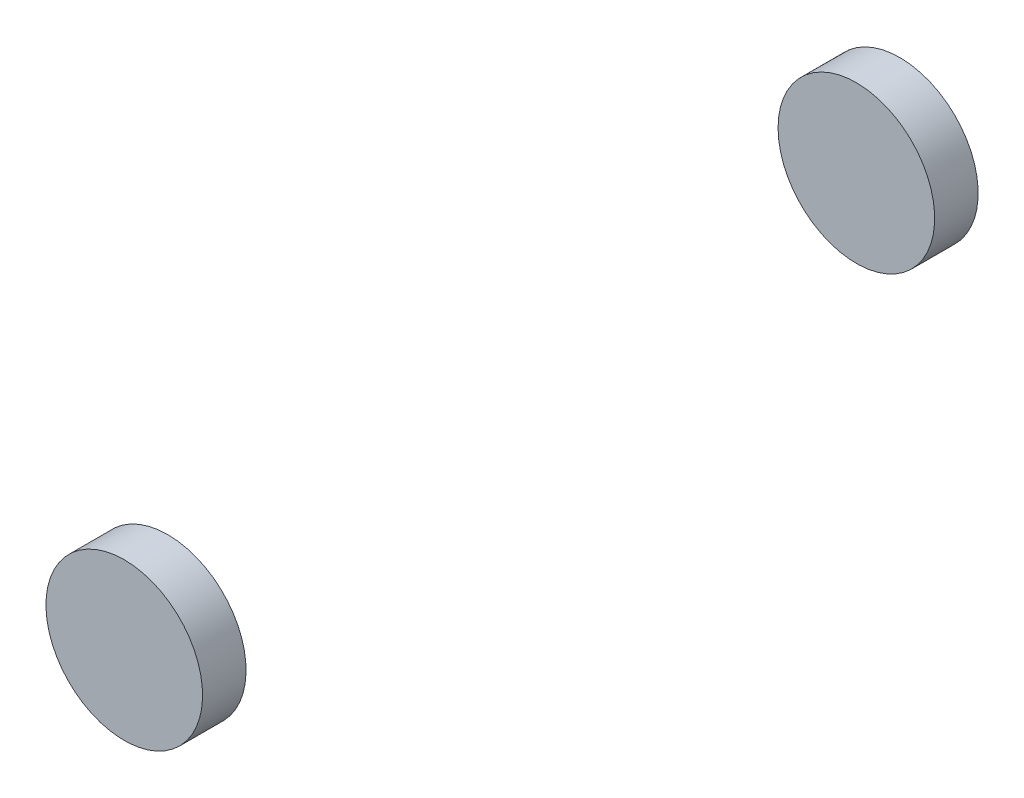
ISO-10303-21;
HEADER;
FILE_DESCRIPTION(('STEP AP214'),'2;1');
FILE_NAME('part.step','',(''),(''),'','','');
FILE_SCHEMA(('AUTOMOTIVE_DESIGN { 1 0 10303 214 1 1 1 1 }'));
ENDSEC;
DATA;
#1=APPLICATION_CONTEXT('core data for automotive mechanical design processes');
#2=APPLICATION_PROTOCOL_DEFINITION('international standard','automotive_design',2000,#1);
#3=PRODUCT_CONTEXT('',#1,'mechanical');
#4=PRODUCT('Part','Part','',(#3));
#5=PRODUCT_RELATED_PRODUCT_CATEGORY('part','',(#4));
#6=PRODUCT_DEFINITION_FORMATION('','',#4);
#7=PRODUCT_DEFINITION_CONTEXT('part definition',#1,'design');
#8=PRODUCT_DEFINITION('design','',#6,#7);
#9=PRODUCT_DEFINITION_SHAPE('','',#8);
#10=(LENGTH_UNIT() NAMED_UNIT(*) SI_UNIT(.MILLI.,.METRE.));
#11=(NAMED_UNIT(*) PLANE_ANGLE_UNIT() SI_UNIT($,.RADIAN.));
#12=(NAMED_UNIT(*) SI_UNIT($,.STERADIAN.) SOLID_ANGLE_UNIT());
#13=UNCERTAINTY_MEASURE_WITH_UNIT(LENGTH_MEASURE(1.E-05),#10,'distance_accuracy_value','');
#14=(GEOMETRIC_REPRESENTATION_CONTEXT(3) GLOBAL_UNCERTAINTY_ASSIGNED_CONTEXT((#13)) GLOBAL_UNIT_ASSIGNED_CONTEXT((#10,
#11,#12)) REPRESENTATION_CONTEXT('',''));
#15=CARTESIAN_POINT('',(0.,0.,0.));
#16=DIRECTION('',(0.,0.,1.));
#17=DIRECTION('',(1.,0.,0.));
#18=AXIS2_PLACEMENT_3D('',#15,#16,#17);
#19=CARTESIAN_POINT('',(12.0649929811173,23.0309677547519,-0.253998963258981));
#20=DIRECTION('',(0.,-8.74227339409092E-08,1.));
#21=DIRECTION('',(1.,-8.74227765734792E-08,0.));
#22=AXIS2_PLACEMENT_3D('',#19,#20,#21);
#23=PLANE('',#22);
#24=CARTESIAN_POINT('',(12.5221929811173,23.0309677147822,-0.253998963258985));
#25=DIRECTION('',(0.,8.74227339409092E-08,-1.));
#26=DIRECTION('',(-1.,8.74227765734792E-08,0.));
#27=AXIS2_PLACEMENT_3D('',#24,#25,#26);
#28=CIRCLE('',#27,0.4572);
#29=CARTESIAN_POINT('',(12.0649929811173,23.0309677547519,-0.253998963258982));
#30=VERTEX_POINT('',#29);
#31=EDGE_CURVE('P0_E10',#30,#30,#28,.T.);
#32=ORIENTED_EDGE('',*,*,#31,.T.);
#33=EDGE_LOOP('',(#32));
#34=FACE_BOUND('',#33,.T.);
#35=ADVANCED_FACE('P0_F15',(#34),#23,.F.);
#36=CARTESIAN_POINT('',(12.0649929811173,23.0309677325465,1.0367410172539E-06));
#37=DIRECTION('',(0.,-8.74227339409092E-08,1.));
#38=DIRECTION('',(1.,-8.74227765734792E-08,0.));
#39=AXIS2_PLACEMENT_3D('',#36,#37,#38);
#40=PLANE('',#39);
#41=CARTESIAN_POINT('',(12.5221929811173,23.0309676925768,1.03674101378445E-06));
#42=DIRECTION('',(0.,8.74227339409092E-08,-1.));
#43=DIRECTION('',(-1.,8.74227765734792E-08,0.));
#44=AXIS2_PLACEMENT_3D('',#41,#42,#43);
#45=CIRCLE('',#44,0.4572);
#46=CARTESIAN_POINT('',(12.0649929811173,23.0309677325465,1.03674101727871E-06));
#47=VERTEX_POINT('',#46);
#48=EDGE_CURVE('P0_E22',#47,#47,#45,.T.);
#49=ORIENTED_EDGE('',*,*,#48,.F.);
#50=EDGE_LOOP('',(#49));
#51=FACE_BOUND('',#50,.T.);
#52=ADVANCED_FACE('P0_F35',(#51),#40,.T.);
#53=CARTESIAN_POINT('',(12.5221929811173,23.0309676925768,1.03674101378445E-06));
#54=DIRECTION('',(0.,-8.74227339409092E-08,1.));
#55=DIRECTION('',(-1.,8.74227765734792E-08,0.));
#56=AXIS2_PLACEMENT_3D('',#53,#54,#55);
#57=CYLINDRICAL_SURFACE('',#56,0.4572);
#58=ORIENTED_EDGE('',*,*,#31,.F.);
#59=EDGE_LOOP('',(#58));
#60=FACE_BOUND('',#59,.T.);
#61=ORIENTED_EDGE('',*,*,#48,.T.);
#62=EDGE_LOOP('',(#61));
#63=FACE_BOUND('',#62,.T.);
#64=ADVANCED_FACE('P0_F33',(#60,#63),#57,.T.);
#65=CLOSED_SHELL('',(#35,#52,#64));
#66=MANIFOLD_SOLID_BREP('P0_B1',#65);
#67=CARTESIAN_POINT('',(8.24719909008972,18.9381646630226,-0.253998923289316));
#68=DIRECTION('',(0.,-8.74227339409095E-08,1.));
#69=DIRECTION('',(-1.19248806384999E-08,-1.,-8.74227339409095E-08));
#70=AXIS2_PLACEMENT_3D('',#67,#68,#69);
#71=PLANE('',#70);
#72=CARTESIAN_POINT('',(8.24719908463767,18.4809646630226,-0.253998963258991));
#73=DIRECTION('',(0.,8.74227339409095E-08,-1.));
#74=DIRECTION('',(1.19248806384999E-08,1.,8.74227339409095E-08));
#75=AXIS2_PLACEMENT_3D('',#72,#73,#74);
#76=CIRCLE('',#75,0.4572);
#77=CARTESIAN_POINT('',(8.24719909008973,18.9381646630226,-0.253998923289317));
#78=VERTEX_POINT('',#77);
#79=EDGE_CURVE('P1_E10',#78,#78,#76,.T.);
#80=ORIENTED_EDGE('',*,*,#79,.T.);
#81=EDGE_LOOP('',(#80));
#82=FACE_BOUND('',#81,.T.);
#83=ADVANCED_FACE('P1_F15',(#82),#71,.F.);
#84=CARTESIAN_POINT('',(8.24719909008972,18.9381646408171,1.07671068285201E-06));
#85=DIRECTION('',(0.,-8.74227339409095E-08,1.));
#86=DIRECTION('',(-1.19248806384999E-08,-1.,-8.74227339409095E-08));
#87=AXIS2_PLACEMENT_3D('',#84,#85,#86);
#88=PLANE('',#87);
#89=CARTESIAN_POINT('',(8.24719908463767,18.4809646408171,1.03674100901396E-06));
#90=DIRECTION('',(0.,8.74227339409095E-08,-1.));
#91=DIRECTION('',(1.19248806384999E-08,1.,8.74227339409095E-08));
#92=AXIS2_PLACEMENT_3D('',#89,#90,#91);
#93=CIRCLE('',#92,0.4572);
#94=CARTESIAN_POINT('',(8.24719909008973,18.9381646408171,1.07671068297175E-06));
#95=VERTEX_POINT('',#94);
#96=EDGE_CURVE('P1_E22',#95,#95,#93,.T.);
#97=ORIENTED_EDGE('',*,*,#96,.F.);
#98=EDGE_LOOP('',(#97));
#99=FACE_BOUND('',#98,.T.);
#100=ADVANCED_FACE('P1_F35',(#99),#88,.T.);
#101=CARTESIAN_POINT('',(8.24719908463767,18.4809646408171,1.03674100901396E-06));
#102=DIRECTION('',(0.,-8.74227339409095E-08,1.));
#103=DIRECTION('',(1.19248806384999E-08,1.,8.74227339409095E-08));
#104=AXIS2_PLACEMENT_3D('',#101,#102,#103);
#105=CYLINDRICAL_SURFACE('',#104,0.4572);
#106=ORIENTED_EDGE('',*,*,#79,.F.);
#107=EDGE_LOOP('',(#106));
#108=FACE_BOUND('',#107,.T.);
#109=ORIENTED_EDGE('',*,*,#96,.T.);
#110=EDGE_LOOP('',(#109));
#111=FACE_BOUND('',#110,.T.);
#112=ADVANCED_FACE('P1_F33',(#108,#111),#105,.T.);
#113=CLOSED_SHELL('',(#83,#100,#112));
#114=MANIFOLD_SOLID_BREP('P1_B1',#113);
#115=ADVANCED_BREP_SHAPE_REPRESENTATION('',(#18,#66,#114),#14);
#116=SHAPE_DEFINITION_REPRESENTATION(#9,#115);
ENDSEC;
END-ISO-10303-21;
